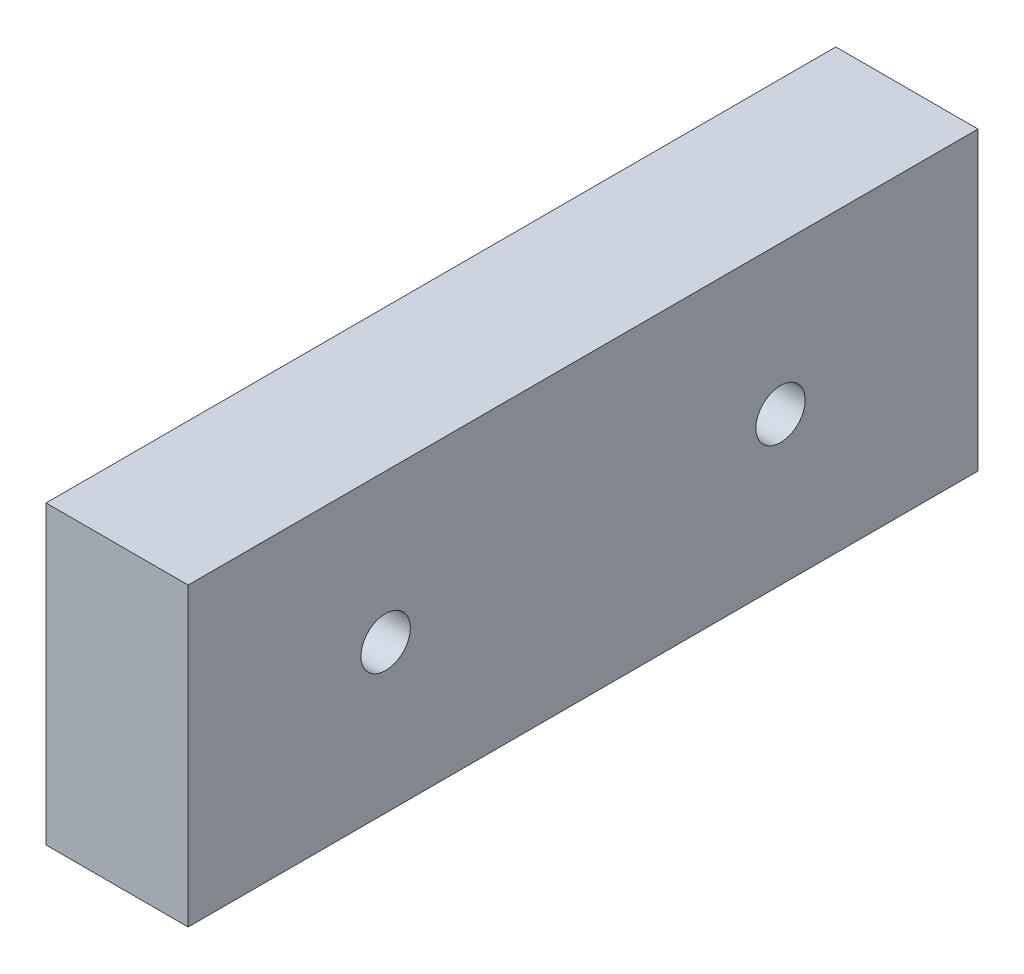
ISO-10303-21;
HEADER;
FILE_DESCRIPTION(('STEP AP214'),'2;1');
FILE_NAME('part.step','',(''),(''),'','','');
FILE_SCHEMA(('AUTOMOTIVE_DESIGN { 1 0 10303 214 1 1 1 1 }'));
ENDSEC;
DATA;
#1=APPLICATION_CONTEXT('core data for automotive mechanical design processes');
#2=APPLICATION_PROTOCOL_DEFINITION('international standard','automotive_design',2000,#1);
#3=PRODUCT_CONTEXT('',#1,'mechanical');
#4=PRODUCT('Part','Part','',(#3));
#5=PRODUCT_RELATED_PRODUCT_CATEGORY('part','',(#4));
#6=PRODUCT_DEFINITION_FORMATION('','',#4);
#7=PRODUCT_DEFINITION_CONTEXT('part definition',#1,'design');
#8=PRODUCT_DEFINITION('design','',#6,#7);
#9=PRODUCT_DEFINITION_SHAPE('','',#8);
#10=(LENGTH_UNIT() NAMED_UNIT(*) SI_UNIT(.MILLI.,.METRE.));
#11=(NAMED_UNIT(*) PLANE_ANGLE_UNIT() SI_UNIT($,.RADIAN.));
#12=(NAMED_UNIT(*) SI_UNIT($,.STERADIAN.) SOLID_ANGLE_UNIT());
#13=UNCERTAINTY_MEASURE_WITH_UNIT(LENGTH_MEASURE(1.E-05),#10,'distance_accuracy_value','');
#14=(GEOMETRIC_REPRESENTATION_CONTEXT(3) GLOBAL_UNCERTAINTY_ASSIGNED_CONTEXT((#13)) GLOBAL_UNIT_ASSIGNED_CONTEXT((#10,
#11,#12)) REPRESENTATION_CONTEXT('',''));
#15=CARTESIAN_POINT('',(0.,0.,0.));
#16=DIRECTION('',(0.,0.,1.));
#17=DIRECTION('',(1.,0.,0.));
#18=AXIS2_PLACEMENT_3D('',#15,#16,#17);
#19=CARTESIAN_POINT('',(18.288,0.,0.));
#20=DIRECTION('',(1.,0.,0.));
#21=DIRECTION('',(0.,0.,-1.));
#22=AXIS2_PLACEMENT_3D('',#19,#20,#21);
#23=PLANE('',#22);
#24=CARTESIAN_POINT('',(18.288,0.,25.4));
#25=DIRECTION('',(1.,0.,0.));
#26=DIRECTION('',(0.,0.,-1.));
#27=AXIS2_PLACEMENT_3D('',#24,#25,#26);
#28=CIRCLE('',#27,3.175);
#29=CARTESIAN_POINT('',(18.288,0.,22.225));
#30=VERTEX_POINT('',#29);
#31=EDGE_CURVE('E100',#30,#30,#28,.T.);
#32=ORIENTED_EDGE('',*,*,#31,.F.);
#33=EDGE_LOOP('',(#32));
#34=FACE_BOUND('',#33,.T.);
#35=DIRECTION('',(0.,-1.,0.));
#36=VECTOR('',#35,1.);
#37=CARTESIAN_POINT('',(18.288,-19.05,50.8));
#38=LINE('',#37,#36);
#39=CARTESIAN_POINT('',(18.288,19.05,50.8));
#40=VERTEX_POINT('',#39);
#41=CARTESIAN_POINT('',(18.288,-19.05,50.8));
#42=VERTEX_POINT('',#41);
#43=EDGE_CURVE('E85',#40,#42,#38,.T.);
#44=ORIENTED_EDGE('',*,*,#43,.T.);
#45=DIRECTION('',(0.,0.,-1.));
#46=VECTOR('',#45,1.);
#47=CARTESIAN_POINT('',(18.288,-19.05,-50.8));
#48=LINE('',#47,#46);
#49=CARTESIAN_POINT('',(18.288,-19.05,-50.8));
#50=VERTEX_POINT('',#49);
#51=EDGE_CURVE('E80',#42,#50,#48,.T.);
#52=ORIENTED_EDGE('',*,*,#51,.T.);
#53=DIRECTION('',(0.,1.,0.));
#54=VECTOR('',#53,1.);
#55=CARTESIAN_POINT('',(18.288,-19.05,-50.8));
#56=LINE('',#55,#54);
#57=CARTESIAN_POINT('',(18.288,19.05,-50.8));
#58=VERTEX_POINT('',#57);
#59=EDGE_CURVE('E83',#50,#58,#56,.T.);
#60=ORIENTED_EDGE('',*,*,#59,.T.);
#61=DIRECTION('',(0.,0.,1.));
#62=VECTOR('',#61,1.);
#63=CARTESIAN_POINT('',(18.288,19.05,-50.8));
#64=LINE('',#63,#62);
#65=EDGE_CURVE('E50',#58,#40,#64,.T.);
#66=ORIENTED_EDGE('',*,*,#65,.T.);
#67=EDGE_LOOP('',(#44,#52,#60,#66));
#68=FACE_BOUND('',#67,.T.);
#69=CARTESIAN_POINT('',(18.288,0.,-25.4));
#70=DIRECTION('',(1.,0.,0.));
#71=DIRECTION('',(0.,0.,-1.));
#72=AXIS2_PLACEMENT_3D('',#69,#70,#71);
#73=CIRCLE('',#72,3.175);
#74=CARTESIAN_POINT('',(18.288,0.,-28.575));
#75=VERTEX_POINT('',#74);
#76=EDGE_CURVE('E115',#75,#75,#73,.T.);
#77=ORIENTED_EDGE('',*,*,#76,.F.);
#78=EDGE_LOOP('',(#77));
#79=FACE_BOUND('',#78,.T.);
#80=ADVANCED_FACE('F33',(#34,#68,#79),#23,.T.);
#81=CARTESIAN_POINT('',(0.,0.,0.));
#82=DIRECTION('',(1.,0.,0.));
#83=DIRECTION('',(0.,0.,-1.));
#84=AXIS2_PLACEMENT_3D('',#81,#82,#83);
#85=PLANE('',#84);
#86=DIRECTION('',(0.,-1.,0.));
#87=VECTOR('',#86,1.);
#88=CARTESIAN_POINT('',(0.,-19.05,50.8));
#89=LINE('',#88,#87);
#90=CARTESIAN_POINT('',(0.,19.05,50.8));
#91=VERTEX_POINT('',#90);
#92=CARTESIAN_POINT('',(0.,-19.05,50.8));
#93=VERTEX_POINT('',#92);
#94=EDGE_CURVE('E97',#91,#93,#89,.T.);
#95=ORIENTED_EDGE('',*,*,#94,.F.);
#96=DIRECTION('',(0.,0.,1.));
#97=VECTOR('',#96,1.);
#98=CARTESIAN_POINT('',(0.,19.05,-50.8));
#99=LINE('',#98,#97);
#100=CARTESIAN_POINT('',(0.,19.05,-50.8));
#101=VERTEX_POINT('',#100);
#102=EDGE_CURVE('E73',#101,#91,#99,.T.);
#103=ORIENTED_EDGE('',*,*,#102,.F.);
#104=DIRECTION('',(0.,1.,0.));
#105=VECTOR('',#104,1.);
#106=CARTESIAN_POINT('',(0.,-19.05,-50.8));
#107=LINE('',#106,#105);
#108=CARTESIAN_POINT('',(0.,-19.05,-50.8));
#109=VERTEX_POINT('',#108);
#110=EDGE_CURVE('E67',#109,#101,#107,.T.);
#111=ORIENTED_EDGE('',*,*,#110,.F.);
#112=DIRECTION('',(0.,0.,-1.));
#113=VECTOR('',#112,1.);
#114=CARTESIAN_POINT('',(0.,-19.05,-50.8));
#115=LINE('',#114,#113);
#116=EDGE_CURVE('E89',#93,#109,#115,.T.);
#117=ORIENTED_EDGE('',*,*,#116,.F.);
#118=EDGE_LOOP('',(#95,#103,#111,#117));
#119=FACE_BOUND('',#118,.T.);
#120=CARTESIAN_POINT('',(0.,0.,25.4));
#121=DIRECTION('',(1.,0.,0.));
#122=DIRECTION('',(0.,0.,-1.));
#123=AXIS2_PLACEMENT_3D('',#120,#121,#122);
#124=CIRCLE('',#123,3.175);
#125=CARTESIAN_POINT('',(0.,0.,22.225));
#126=VERTEX_POINT('',#125);
#127=EDGE_CURVE('E112',#126,#126,#124,.T.);
#128=ORIENTED_EDGE('',*,*,#127,.T.);
#129=EDGE_LOOP('',(#128));
#130=FACE_BOUND('',#129,.T.);
#131=CARTESIAN_POINT('',(0.,0.,-25.4));
#132=DIRECTION('',(1.,0.,0.));
#133=DIRECTION('',(0.,0.,-1.));
#134=AXIS2_PLACEMENT_3D('',#131,#132,#133);
#135=CIRCLE('',#134,3.175);
#136=CARTESIAN_POINT('',(0.,0.,-28.575));
#137=VERTEX_POINT('',#136);
#138=EDGE_CURVE('E118',#137,#137,#135,.T.);
#139=ORIENTED_EDGE('',*,*,#138,.T.);
#140=EDGE_LOOP('',(#139));
#141=FACE_BOUND('',#140,.T.);
#142=ADVANCED_FACE('F108',(#119,#130,#141),#85,.F.);
#143=CARTESIAN_POINT('',(18.288,-19.05,50.8));
#144=DIRECTION('',(0.,0.,-1.));
#145=DIRECTION('',(-1.,0.,0.));
#146=AXIS2_PLACEMENT_3D('',#143,#144,#145);
#147=PLANE('',#146);
#148=ORIENTED_EDGE('',*,*,#94,.T.);
#149=DIRECTION('',(-1.,0.,0.));
#150=VECTOR('',#149,1.);
#151=CARTESIAN_POINT('',(18.288,-19.05,50.8));
#152=LINE('',#151,#150);
#153=EDGE_CURVE('E11',#42,#93,#152,.T.);
#154=ORIENTED_EDGE('',*,*,#153,.F.);
#155=ORIENTED_EDGE('',*,*,#43,.F.);
#156=DIRECTION('',(-1.,0.,0.));
#157=VECTOR('',#156,1.);
#158=CARTESIAN_POINT('',(18.288,19.05,50.8));
#159=LINE('',#158,#157);
#160=EDGE_CURVE('E93',#40,#91,#159,.T.);
#161=ORIENTED_EDGE('',*,*,#160,.T.);
#162=EDGE_LOOP('',(#148,#154,#155,#161));
#163=FACE_BOUND('',#162,.T.);
#164=ADVANCED_FACE('F35',(#163),#147,.F.);
#165=CARTESIAN_POINT('',(18.288,-19.05,-50.8));
#166=DIRECTION('',(0.,1.,0.));
#167=DIRECTION('',(0.,0.,1.));
#168=AXIS2_PLACEMENT_3D('',#165,#166,#167);
#169=PLANE('',#168);
#170=ORIENTED_EDGE('',*,*,#116,.T.);
#171=DIRECTION('',(-1.,0.,0.));
#172=VECTOR('',#171,1.);
#173=CARTESIAN_POINT('',(18.288,-19.05,-50.8));
#174=LINE('',#173,#172);
#175=EDGE_CURVE('E42',#50,#109,#174,.T.);
#176=ORIENTED_EDGE('',*,*,#175,.F.);
#177=ORIENTED_EDGE('',*,*,#51,.F.);
#178=ORIENTED_EDGE('',*,*,#153,.T.);
#179=EDGE_LOOP('',(#170,#176,#177,#178));
#180=FACE_BOUND('',#179,.T.);
#181=ADVANCED_FACE('F88',(#180),#169,.F.);
#182=CARTESIAN_POINT('',(18.288,-19.05,-50.8));
#183=DIRECTION('',(0.,0.,1.));
#184=DIRECTION('',(1.,0.,0.));
#185=AXIS2_PLACEMENT_3D('',#182,#183,#184);
#186=PLANE('',#185);
#187=ORIENTED_EDGE('',*,*,#110,.T.);
#188=DIRECTION('',(-1.,0.,0.));
#189=VECTOR('',#188,1.);
#190=CARTESIAN_POINT('',(18.288,19.05,-50.8));
#191=LINE('',#190,#189);
#192=EDGE_CURVE('E90',#58,#101,#191,.T.);
#193=ORIENTED_EDGE('',*,*,#192,.F.);
#194=ORIENTED_EDGE('',*,*,#59,.F.);
#195=ORIENTED_EDGE('',*,*,#175,.T.);
#196=EDGE_LOOP('',(#187,#193,#194,#195));
#197=FACE_BOUND('',#196,.T.);
#198=ADVANCED_FACE('F91',(#197),#186,.F.);
#199=CARTESIAN_POINT('',(18.288,19.05,-50.8));
#200=DIRECTION('',(0.,-1.,0.));
#201=DIRECTION('',(0.,0.,-1.));
#202=AXIS2_PLACEMENT_3D('',#199,#200,#201);
#203=PLANE('',#202);
#204=ORIENTED_EDGE('',*,*,#102,.T.);
#205=ORIENTED_EDGE('',*,*,#160,.F.);
#206=ORIENTED_EDGE('',*,*,#65,.F.);
#207=ORIENTED_EDGE('',*,*,#192,.T.);
#208=EDGE_LOOP('',(#204,#205,#206,#207));
#209=FACE_BOUND('',#208,.T.);
#210=ADVANCED_FACE('F105',(#209),#203,.F.);
#211=CARTESIAN_POINT('',(18.288,0.,25.4));
#212=DIRECTION('',(-1.,0.,0.));
#213=DIRECTION('',(0.,0.,1.));
#214=AXIS2_PLACEMENT_3D('',#211,#212,#213);
#215=CYLINDRICAL_SURFACE('',#214,3.175);
#216=ORIENTED_EDGE('',*,*,#31,.T.);
#217=EDGE_LOOP('',(#216));
#218=FACE_BOUND('',#217,.T.);
#219=ORIENTED_EDGE('',*,*,#127,.F.);
#220=EDGE_LOOP('',(#219));
#221=FACE_BOUND('',#220,.T.);
#222=ADVANCED_FACE('F135',(#218,#221),#215,.F.);
#223=CARTESIAN_POINT('',(18.288,0.,-25.4));
#224=DIRECTION('',(-1.,0.,0.));
#225=DIRECTION('',(0.,0.,1.));
#226=AXIS2_PLACEMENT_3D('',#223,#224,#225);
#227=CYLINDRICAL_SURFACE('',#226,3.175);
#228=ORIENTED_EDGE('',*,*,#76,.T.);
#229=EDGE_LOOP('',(#228));
#230=FACE_BOUND('',#229,.T.);
#231=ORIENTED_EDGE('',*,*,#138,.F.);
#232=EDGE_LOOP('',(#231));
#233=FACE_BOUND('',#232,.T.);
#234=ADVANCED_FACE('F124',(#230,#233),#227,.F.);
#235=CLOSED_SHELL('',(#80,#142,#164,#181,#198,#210,#222,#234));
#236=MANIFOLD_SOLID_BREP('B2',#235);
#237=ADVANCED_BREP_SHAPE_REPRESENTATION('',(#18,#236),#14);
#238=SHAPE_DEFINITION_REPRESENTATION(#9,#237);
ENDSEC;
END-ISO-10303-21;
